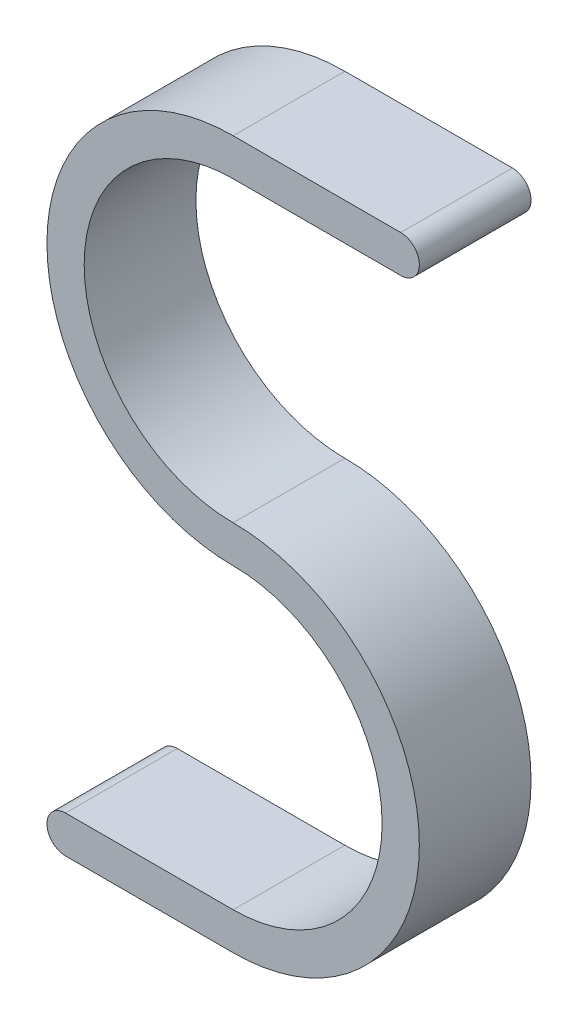
ISO-10303-21;
HEADER;
FILE_DESCRIPTION(('STEP AP214'),'2;1');
FILE_NAME('part.step','',(''),(''),'','','');
FILE_SCHEMA(('AUTOMOTIVE_DESIGN { 1 0 10303 214 1 1 1 1 }'));
ENDSEC;
DATA;
#1=APPLICATION_CONTEXT('core data for automotive mechanical design processes');
#2=APPLICATION_PROTOCOL_DEFINITION('international standard','automotive_design',2000,#1);
#3=PRODUCT_CONTEXT('',#1,'mechanical');
#4=PRODUCT('Part','Part','',(#3));
#5=PRODUCT_RELATED_PRODUCT_CATEGORY('part','',(#4));
#6=PRODUCT_DEFINITION_FORMATION('','',#4);
#7=PRODUCT_DEFINITION_CONTEXT('part definition',#1,'design');
#8=PRODUCT_DEFINITION('design','',#6,#7);
#9=PRODUCT_DEFINITION_SHAPE('','',#8);
#10=(LENGTH_UNIT() NAMED_UNIT(*) SI_UNIT(.MILLI.,.METRE.));
#11=(NAMED_UNIT(*) PLANE_ANGLE_UNIT() SI_UNIT($,.RADIAN.));
#12=(NAMED_UNIT(*) SI_UNIT($,.STERADIAN.) SOLID_ANGLE_UNIT());
#13=UNCERTAINTY_MEASURE_WITH_UNIT(LENGTH_MEASURE(1.E-05),#10,'distance_accuracy_value','');
#14=(GEOMETRIC_REPRESENTATION_CONTEXT(3) GLOBAL_UNCERTAINTY_ASSIGNED_CONTEXT((#13)) GLOBAL_UNIT_ASSIGNED_CONTEXT((#10,
#11,#12)) REPRESENTATION_CONTEXT('',''));
#15=CARTESIAN_POINT('',(0.,0.,0.));
#16=DIRECTION('',(0.,0.,1.));
#17=DIRECTION('',(1.,0.,0.));
#18=AXIS2_PLACEMENT_3D('',#15,#16,#17);
#19=CARTESIAN_POINT('',(0.,-25.,15.));
#20=DIRECTION('',(0.,0.,-1.));
#21=DIRECTION('',(-1.,0.,0.));
#22=AXIS2_PLACEMENT_3D('',#19,#20,#21);
#23=CYLINDRICAL_SURFACE('',#22,25.);
#24=CARTESIAN_POINT('',(0.,-25.,0.));
#25=DIRECTION('',(0.,0.,1.));
#26=DIRECTION('',(1.,0.,0.));
#27=AXIS2_PLACEMENT_3D('',#24,#25,#26);
#28=CIRCLE('',#27,25.);
#29=CARTESIAN_POINT('',(0.,-50.,0.));
#30=VERTEX_POINT('',#29);
#31=CARTESIAN_POINT('',(0.,0.,0.));
#32=VERTEX_POINT('',#31);
#33=EDGE_CURVE('E145',#30,#32,#28,.T.);
#34=ORIENTED_EDGE('',*,*,#33,.T.);
#35=DIRECTION('',(0.,0.,-1.));
#36=VECTOR('',#35,1.);
#37=CARTESIAN_POINT('',(0.,0.,15.));
#38=LINE('',#37,#36);
#39=CARTESIAN_POINT('',(0.,0.,15.));
#40=VERTEX_POINT('',#39);
#41=EDGE_CURVE('E11',#40,#32,#38,.T.);
#42=ORIENTED_EDGE('',*,*,#41,.F.);
#43=CARTESIAN_POINT('',(0.,-25.,15.));
#44=DIRECTION('',(0.,0.,1.));
#45=DIRECTION('',(1.,0.,0.));
#46=AXIS2_PLACEMENT_3D('',#43,#44,#45);
#47=CIRCLE('',#46,25.);
#48=CARTESIAN_POINT('',(0.,-50.,15.));
#49=VERTEX_POINT('',#48);
#50=EDGE_CURVE('E163',#49,#40,#47,.T.);
#51=ORIENTED_EDGE('',*,*,#50,.F.);
#52=DIRECTION('',(0.,0.,-1.));
#53=VECTOR('',#52,1.);
#54=CARTESIAN_POINT('',(0.,-50.,15.));
#55=LINE('',#54,#53);
#56=EDGE_CURVE('E141',#49,#30,#55,.T.);
#57=ORIENTED_EDGE('',*,*,#56,.T.);
#58=EDGE_LOOP('',(#34,#42,#51,#57));
#59=FACE_BOUND('',#58,.T.);
#60=ADVANCED_FACE('F37',(#59),#23,.T.);
#61=CARTESIAN_POINT('',(0.,20.,15.));
#62=DIRECTION('',(0.,0.,-1.));
#63=DIRECTION('',(-1.,0.,0.));
#64=AXIS2_PLACEMENT_3D('',#61,#62,#63);
#65=CYLINDRICAL_SURFACE('',#64,20.);
#66=CARTESIAN_POINT('',(0.,20.,0.));
#67=DIRECTION('',(0.,0.,-1.));
#68=DIRECTION('',(1.,0.,0.));
#69=AXIS2_PLACEMENT_3D('',#66,#67,#68);
#70=CIRCLE('',#69,20.);
#71=CARTESIAN_POINT('',(0.,40.,0.));
#72=VERTEX_POINT('',#71);
#73=EDGE_CURVE('E148',#32,#72,#70,.T.);
#74=ORIENTED_EDGE('',*,*,#73,.T.);
#75=DIRECTION('',(0.,0.,-1.));
#76=VECTOR('',#75,1.);
#77=CARTESIAN_POINT('',(0.,40.,15.));
#78=LINE('',#77,#76);
#79=CARTESIAN_POINT('',(0.,40.,15.));
#80=VERTEX_POINT('',#79);
#81=EDGE_CURVE('E45',#80,#72,#78,.T.);
#82=ORIENTED_EDGE('',*,*,#81,.F.);
#83=CARTESIAN_POINT('',(0.,20.,15.));
#84=DIRECTION('',(0.,0.,-1.));
#85=DIRECTION('',(1.,0.,0.));
#86=AXIS2_PLACEMENT_3D('',#83,#84,#85);
#87=CIRCLE('',#86,20.);
#88=EDGE_CURVE('E102',#40,#80,#87,.T.);
#89=ORIENTED_EDGE('',*,*,#88,.F.);
#90=ORIENTED_EDGE('',*,*,#41,.T.);
#91=EDGE_LOOP('',(#74,#82,#89,#90));
#92=FACE_BOUND('',#91,.T.);
#93=ADVANCED_FACE('F212',(#92),#65,.F.);
#94=CARTESIAN_POINT('',(22.5,40.,15.));
#95=DIRECTION('',(0.,1.,0.));
#96=DIRECTION('',(0.,0.,1.));
#97=AXIS2_PLACEMENT_3D('',#94,#95,#96);
#98=PLANE('',#97);
#99=DIRECTION('',(1.,0.,0.));
#100=VECTOR('',#99,1.);
#101=CARTESIAN_POINT('',(22.5,40.,0.));
#102=LINE('',#101,#100);
#103=CARTESIAN_POINT('',(22.5,40.,0.));
#104=VERTEX_POINT('',#103);
#105=EDGE_CURVE('E150',#72,#104,#102,.T.);
#106=ORIENTED_EDGE('',*,*,#105,.T.);
#107=DIRECTION('',(0.,0.,-1.));
#108=VECTOR('',#107,1.);
#109=CARTESIAN_POINT('',(22.5,40.,15.));
#110=LINE('',#109,#108);
#111=CARTESIAN_POINT('',(22.5,40.,15.));
#112=VERTEX_POINT('',#111);
#113=EDGE_CURVE('E176',#112,#104,#110,.T.);
#114=ORIENTED_EDGE('',*,*,#113,.F.);
#115=DIRECTION('',(1.,0.,0.));
#116=VECTOR('',#115,1.);
#117=CARTESIAN_POINT('',(22.5,40.,15.));
#118=LINE('',#117,#116);
#119=EDGE_CURVE('E184',#80,#112,#118,.T.);
#120=ORIENTED_EDGE('',*,*,#119,.F.);
#121=ORIENTED_EDGE('',*,*,#81,.T.);
#122=EDGE_LOOP('',(#106,#114,#120,#121));
#123=FACE_BOUND('',#122,.T.);
#124=ADVANCED_FACE('F182',(#123),#98,.F.);
#125=CARTESIAN_POINT('',(22.5,42.5,15.));
#126=DIRECTION('',(0.,0.,-1.));
#127=DIRECTION('',(-1.,0.,0.));
#128=AXIS2_PLACEMENT_3D('',#125,#126,#127);
#129=CYLINDRICAL_SURFACE('',#128,2.5);
#130=CARTESIAN_POINT('',(22.5,42.5,0.));
#131=DIRECTION('',(0.,0.,1.));
#132=DIRECTION('',(-1.,0.,0.));
#133=AXIS2_PLACEMENT_3D('',#130,#131,#132);
#134=CIRCLE('',#133,2.5);
#135=CARTESIAN_POINT('',(22.5,45.,0.));
#136=VERTEX_POINT('',#135);
#137=EDGE_CURVE('E152',#104,#136,#134,.T.);
#138=ORIENTED_EDGE('',*,*,#137,.T.);
#139=DIRECTION('',(0.,0.,-1.));
#140=VECTOR('',#139,1.);
#141=CARTESIAN_POINT('',(22.5,45.,15.));
#142=LINE('',#141,#140);
#143=CARTESIAN_POINT('',(22.5,45.,15.));
#144=VERTEX_POINT('',#143);
#145=EDGE_CURVE('E173',#144,#136,#142,.T.);
#146=ORIENTED_EDGE('',*,*,#145,.F.);
#147=CARTESIAN_POINT('',(22.5,42.5,15.));
#148=DIRECTION('',(0.,0.,1.));
#149=DIRECTION('',(-1.,0.,0.));
#150=AXIS2_PLACEMENT_3D('',#147,#148,#149);
#151=CIRCLE('',#150,2.5);
#152=EDGE_CURVE('E202',#112,#144,#151,.T.);
#153=ORIENTED_EDGE('',*,*,#152,.F.);
#154=ORIENTED_EDGE('',*,*,#113,.T.);
#155=EDGE_LOOP('',(#138,#146,#153,#154));
#156=FACE_BOUND('',#155,.T.);
#157=ADVANCED_FACE('F193',(#156),#129,.T.);
#158=CARTESIAN_POINT('',(0.,45.,15.));
#159=DIRECTION('',(0.,-1.,0.));
#160=DIRECTION('',(1.,0.,0.));
#161=AXIS2_PLACEMENT_3D('',#158,#159,#160);
#162=PLANE('',#161);
#163=DIRECTION('',(-1.,0.,0.));
#164=VECTOR('',#163,1.);
#165=CARTESIAN_POINT('',(0.,45.,0.));
#166=LINE('',#165,#164);
#167=CARTESIAN_POINT('',(0.,45.,0.));
#168=VERTEX_POINT('',#167);
#169=EDGE_CURVE('E154',#136,#168,#166,.T.);
#170=ORIENTED_EDGE('',*,*,#169,.T.);
#171=DIRECTION('',(0.,0.,-1.));
#172=VECTOR('',#171,1.);
#173=CARTESIAN_POINT('',(0.,45.,15.));
#174=LINE('',#173,#172);
#175=CARTESIAN_POINT('',(0.,45.,15.));
#176=VERTEX_POINT('',#175);
#177=EDGE_CURVE('E170',#176,#168,#174,.T.);
#178=ORIENTED_EDGE('',*,*,#177,.F.);
#179=DIRECTION('',(-1.,0.,0.));
#180=VECTOR('',#179,1.);
#181=CARTESIAN_POINT('',(0.,45.,15.));
#182=LINE('',#181,#180);
#183=EDGE_CURVE('E199',#144,#176,#182,.T.);
#184=ORIENTED_EDGE('',*,*,#183,.F.);
#185=ORIENTED_EDGE('',*,*,#145,.T.);
#186=EDGE_LOOP('',(#170,#178,#184,#185));
#187=FACE_BOUND('',#186,.T.);
#188=ADVANCED_FACE('F197',(#187),#162,.F.);
#189=CARTESIAN_POINT('',(0.,20.,15.));
#190=DIRECTION('',(0.,0.,-1.));
#191=DIRECTION('',(-1.,0.,0.));
#192=AXIS2_PLACEMENT_3D('',#189,#190,#191);
#193=CYLINDRICAL_SURFACE('',#192,25.);
#194=CARTESIAN_POINT('',(0.,20.,0.));
#195=DIRECTION('',(0.,0.,1.));
#196=DIRECTION('',(1.,0.,0.));
#197=AXIS2_PLACEMENT_3D('',#194,#195,#196);
#198=CIRCLE('',#197,25.);
#199=CARTESIAN_POINT('',(0.,-5.00000000000001,0.));
#200=VERTEX_POINT('',#199);
#201=EDGE_CURVE('E156',#168,#200,#198,.T.);
#202=ORIENTED_EDGE('',*,*,#201,.T.);
#203=DIRECTION('',(0.,0.,-1.));
#204=VECTOR('',#203,1.);
#205=CARTESIAN_POINT('',(0.,-5.00000000000001,15.));
#206=LINE('',#205,#204);
#207=CARTESIAN_POINT('',(0.,-5.00000000000001,15.));
#208=VERTEX_POINT('',#207);
#209=EDGE_CURVE('E167',#208,#200,#206,.T.);
#210=ORIENTED_EDGE('',*,*,#209,.F.);
#211=CARTESIAN_POINT('',(0.,20.,15.));
#212=DIRECTION('',(0.,0.,1.));
#213=DIRECTION('',(1.,0.,0.));
#214=AXIS2_PLACEMENT_3D('',#211,#212,#213);
#215=CIRCLE('',#214,25.);
#216=EDGE_CURVE('E201',#176,#208,#215,.T.);
#217=ORIENTED_EDGE('',*,*,#216,.F.);
#218=ORIENTED_EDGE('',*,*,#177,.T.);
#219=EDGE_LOOP('',(#202,#210,#217,#218));
#220=FACE_BOUND('',#219,.T.);
#221=ADVANCED_FACE('F224',(#220),#193,.T.);
#222=CARTESIAN_POINT('',(0.,-25.,15.));
#223=DIRECTION('',(0.,0.,-1.));
#224=DIRECTION('',(-1.,0.,0.));
#225=AXIS2_PLACEMENT_3D('',#222,#223,#224);
#226=CYLINDRICAL_SURFACE('',#225,20.);
#227=CARTESIAN_POINT('',(0.,-25.,0.));
#228=DIRECTION('',(0.,0.,-1.));
#229=DIRECTION('',(1.,0.,0.));
#230=AXIS2_PLACEMENT_3D('',#227,#228,#229);
#231=CIRCLE('',#230,20.);
#232=CARTESIAN_POINT('',(0.,-45.,0.));
#233=VERTEX_POINT('',#232);
#234=EDGE_CURVE('E158',#200,#233,#231,.T.);
#235=ORIENTED_EDGE('',*,*,#234,.T.);
#236=DIRECTION('',(0.,0.,-1.));
#237=VECTOR('',#236,1.);
#238=CARTESIAN_POINT('',(0.,-45.,15.));
#239=LINE('',#238,#237);
#240=CARTESIAN_POINT('',(0.,-45.,15.));
#241=VERTEX_POINT('',#240);
#242=EDGE_CURVE('E136',#241,#233,#239,.T.);
#243=ORIENTED_EDGE('',*,*,#242,.F.);
#244=CARTESIAN_POINT('',(0.,-25.,15.));
#245=DIRECTION('',(0.,0.,-1.));
#246=DIRECTION('',(1.,0.,0.));
#247=AXIS2_PLACEMENT_3D('',#244,#245,#246);
#248=CIRCLE('',#247,20.);
#249=EDGE_CURVE('E127',#208,#241,#248,.T.);
#250=ORIENTED_EDGE('',*,*,#249,.F.);
#251=ORIENTED_EDGE('',*,*,#209,.T.);
#252=EDGE_LOOP('',(#235,#243,#250,#251));
#253=FACE_BOUND('',#252,.T.);
#254=ADVANCED_FACE('F227',(#253),#226,.F.);
#255=CARTESIAN_POINT('',(0.,-45.,15.));
#256=DIRECTION('',(0.,-1.,0.));
#257=DIRECTION('',(1.,0.,0.));
#258=AXIS2_PLACEMENT_3D('',#255,#256,#257);
#259=PLANE('',#258);
#260=DIRECTION('',(-1.,0.,0.));
#261=VECTOR('',#260,1.);
#262=CARTESIAN_POINT('',(0.,-45.,0.));
#263=LINE('',#262,#261);
#264=CARTESIAN_POINT('',(-22.5,-45.,0.));
#265=VERTEX_POINT('',#264);
#266=EDGE_CURVE('E135',#233,#265,#263,.T.);
#267=ORIENTED_EDGE('',*,*,#266,.T.);
#268=DIRECTION('',(0.,0.,-1.));
#269=VECTOR('',#268,1.);
#270=CARTESIAN_POINT('',(-22.5,-45.,15.));
#271=LINE('',#270,#269);
#272=CARTESIAN_POINT('',(-22.5,-45.,15.));
#273=VERTEX_POINT('',#272);
#274=EDGE_CURVE('E132',#273,#265,#271,.T.);
#275=ORIENTED_EDGE('',*,*,#274,.F.);
#276=DIRECTION('',(-1.,0.,0.));
#277=VECTOR('',#276,1.);
#278=CARTESIAN_POINT('',(0.,-45.,15.));
#279=LINE('',#278,#277);
#280=EDGE_CURVE('E121',#241,#273,#279,.T.);
#281=ORIENTED_EDGE('',*,*,#280,.F.);
#282=ORIENTED_EDGE('',*,*,#242,.T.);
#283=EDGE_LOOP('',(#267,#275,#281,#282));
#284=FACE_BOUND('',#283,.T.);
#285=ADVANCED_FACE('F133',(#284),#259,.F.);
#286=CARTESIAN_POINT('',(-22.5,-47.5,15.));
#287=DIRECTION('',(0.,0.,-1.));
#288=DIRECTION('',(-1.,0.,0.));
#289=AXIS2_PLACEMENT_3D('',#286,#287,#288);
#290=CYLINDRICAL_SURFACE('',#289,2.49999999999999);
#291=CARTESIAN_POINT('',(-22.5,-47.5,0.));
#292=DIRECTION('',(0.,0.,1.));
#293=DIRECTION('',(-1.,0.,0.));
#294=AXIS2_PLACEMENT_3D('',#291,#292,#293);
#295=CIRCLE('',#294,2.49999999999999);
#296=CARTESIAN_POINT('',(-22.5,-50.,0.));
#297=VERTEX_POINT('',#296);
#298=EDGE_CURVE('E88',#265,#297,#295,.T.);
#299=ORIENTED_EDGE('',*,*,#298,.T.);
#300=DIRECTION('',(0.,0.,-1.));
#301=VECTOR('',#300,1.);
#302=CARTESIAN_POINT('',(-22.5,-50.,15.));
#303=LINE('',#302,#301);
#304=CARTESIAN_POINT('',(-22.5,-50.,15.));
#305=VERTEX_POINT('',#304);
#306=EDGE_CURVE('E137',#305,#297,#303,.T.);
#307=ORIENTED_EDGE('',*,*,#306,.F.);
#308=CARTESIAN_POINT('',(-22.5,-47.5,15.));
#309=DIRECTION('',(0.,0.,1.));
#310=DIRECTION('',(-1.,0.,0.));
#311=AXIS2_PLACEMENT_3D('',#308,#309,#310);
#312=CIRCLE('',#311,2.49999999999999);
#313=EDGE_CURVE('E125',#273,#305,#312,.T.);
#314=ORIENTED_EDGE('',*,*,#313,.F.);
#315=ORIENTED_EDGE('',*,*,#274,.T.);
#316=EDGE_LOOP('',(#299,#307,#314,#315));
#317=FACE_BOUND('',#316,.T.);
#318=ADVANCED_FACE('F139',(#317),#290,.T.);
#319=CARTESIAN_POINT('',(0.,-50.,15.));
#320=DIRECTION('',(0.,1.,0.));
#321=DIRECTION('',(0.,0.,1.));
#322=AXIS2_PLACEMENT_3D('',#319,#320,#321);
#323=PLANE('',#322);
#324=DIRECTION('',(1.,0.,0.));
#325=VECTOR('',#324,1.);
#326=CARTESIAN_POINT('',(0.,-50.,0.));
#327=LINE('',#326,#325);
#328=EDGE_CURVE('E94',#297,#30,#327,.T.);
#329=ORIENTED_EDGE('',*,*,#328,.T.);
#330=ORIENTED_EDGE('',*,*,#56,.F.);
#331=DIRECTION('',(1.,0.,0.));
#332=VECTOR('',#331,1.);
#333=CARTESIAN_POINT('',(0.,-50.,15.));
#334=LINE('',#333,#332);
#335=EDGE_CURVE('E53',#305,#49,#334,.T.);
#336=ORIENTED_EDGE('',*,*,#335,.F.);
#337=ORIENTED_EDGE('',*,*,#306,.T.);
#338=EDGE_LOOP('',(#329,#330,#336,#337));
#339=FACE_BOUND('',#338,.T.);
#340=ADVANCED_FACE('F236',(#339),#323,.F.);
#341=CARTESIAN_POINT('',(0.,-25.,15.));
#342=DIRECTION('',(0.,0.,1.));
#343=DIRECTION('',(1.,0.,0.));
#344=AXIS2_PLACEMENT_3D('',#341,#342,#343);
#345=PLANE('',#344);
#346=ORIENTED_EDGE('',*,*,#50,.T.);
#347=ORIENTED_EDGE('',*,*,#88,.T.);
#348=ORIENTED_EDGE('',*,*,#119,.T.);
#349=ORIENTED_EDGE('',*,*,#152,.T.);
#350=ORIENTED_EDGE('',*,*,#183,.T.);
#351=ORIENTED_EDGE('',*,*,#216,.T.);
#352=ORIENTED_EDGE('',*,*,#249,.T.);
#353=ORIENTED_EDGE('',*,*,#280,.T.);
#354=ORIENTED_EDGE('',*,*,#313,.T.);
#355=ORIENTED_EDGE('',*,*,#335,.T.);
#356=EDGE_LOOP('',(#346,#347,#348,#349,#350,#351,#352,#353,#354,#355));
#357=FACE_BOUND('',#356,.T.);
#358=ADVANCED_FACE('F123',(#357),#345,.T.);
#359=CARTESIAN_POINT('',(0.,-25.,0.));
#360=DIRECTION('',(0.,0.,1.));
#361=DIRECTION('',(1.,0.,0.));
#362=AXIS2_PLACEMENT_3D('',#359,#360,#361);
#363=PLANE('',#362);
#364=ORIENTED_EDGE('',*,*,#33,.F.);
#365=ORIENTED_EDGE('',*,*,#328,.F.);
#366=ORIENTED_EDGE('',*,*,#298,.F.);
#367=ORIENTED_EDGE('',*,*,#266,.F.);
#368=ORIENTED_EDGE('',*,*,#234,.F.);
#369=ORIENTED_EDGE('',*,*,#201,.F.);
#370=ORIENTED_EDGE('',*,*,#169,.F.);
#371=ORIENTED_EDGE('',*,*,#137,.F.);
#372=ORIENTED_EDGE('',*,*,#105,.F.);
#373=ORIENTED_EDGE('',*,*,#73,.F.);
#374=EDGE_LOOP('',(#364,#365,#366,#367,#368,#369,#370,#371,#372,#373));
#375=FACE_BOUND('',#374,.T.);
#376=ADVANCED_FACE('F188',(#375),#363,.F.);
#377=CLOSED_SHELL('',(#60,#93,#124,#157,#188,#221,#254,#285,#318,#340,#358,#376));
#378=MANIFOLD_SOLID_BREP('B2',#377);
#379=ADVANCED_BREP_SHAPE_REPRESENTATION('',(#18,#378),#14);
#380=SHAPE_DEFINITION_REPRESENTATION(#9,#379);
ENDSEC;
END-ISO-10303-21;
